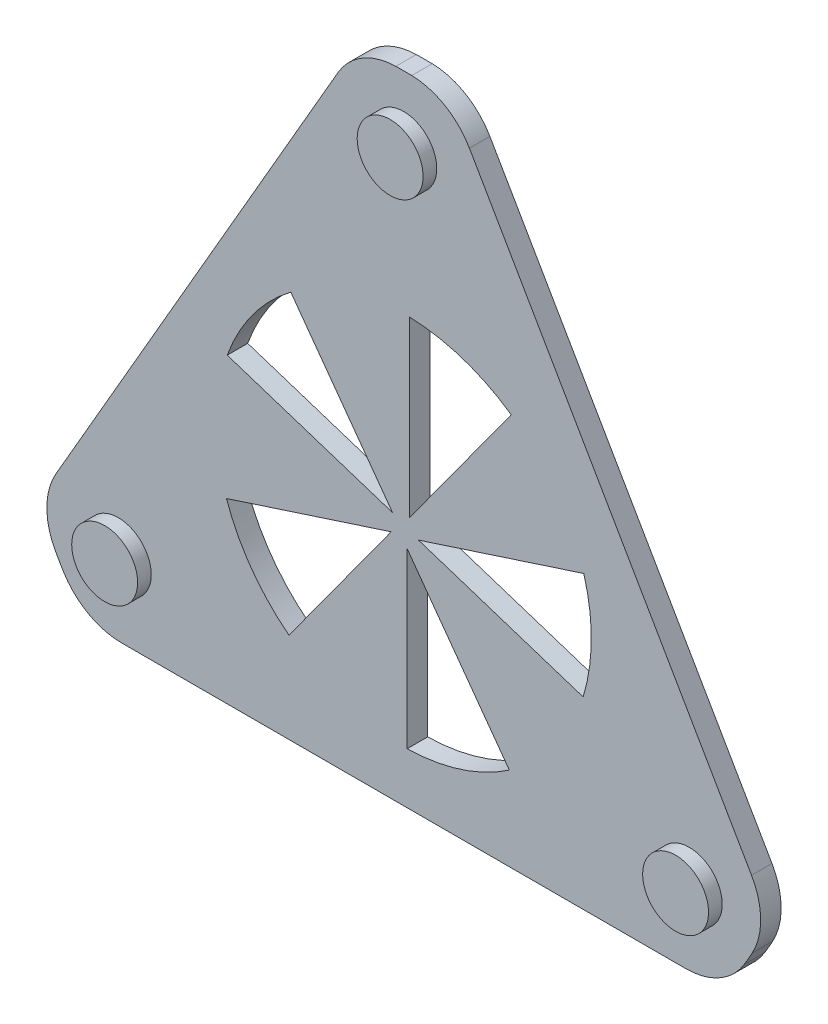
ISO-10303-21;
HEADER;
FILE_DESCRIPTION(('STEP AP214'),'2;1');
FILE_NAME('part.step','',(''),(''),'','','');
FILE_SCHEMA(('AUTOMOTIVE_DESIGN { 1 0 10303 214 1 1 1 1 }'));
ENDSEC;
DATA;
#1=APPLICATION_CONTEXT('core data for automotive mechanical design processes');
#2=APPLICATION_PROTOCOL_DEFINITION('international standard','automotive_design',2000,#1);
#3=PRODUCT_CONTEXT('',#1,'mechanical');
#4=PRODUCT('Part','Part','',(#3));
#5=PRODUCT_RELATED_PRODUCT_CATEGORY('part','',(#4));
#6=PRODUCT_DEFINITION_FORMATION('','',#4);
#7=PRODUCT_DEFINITION_CONTEXT('part definition',#1,'design');
#8=PRODUCT_DEFINITION('design','',#6,#7);
#9=PRODUCT_DEFINITION_SHAPE('','',#8);
#10=(LENGTH_UNIT() NAMED_UNIT(*) SI_UNIT(.MILLI.,.METRE.));
#11=(NAMED_UNIT(*) PLANE_ANGLE_UNIT() SI_UNIT($,.RADIAN.));
#12=(NAMED_UNIT(*) SI_UNIT($,.STERADIAN.) SOLID_ANGLE_UNIT());
#13=UNCERTAINTY_MEASURE_WITH_UNIT(LENGTH_MEASURE(1.E-05),#10,'distance_accuracy_value','');
#14=(GEOMETRIC_REPRESENTATION_CONTEXT(3) GLOBAL_UNCERTAINTY_ASSIGNED_CONTEXT((#13)) GLOBAL_UNIT_ASSIGNED_CONTEXT((#10,
#11,#12)) REPRESENTATION_CONTEXT('',''));
#15=CARTESIAN_POINT('',(0.,0.,0.));
#16=DIRECTION('',(0.,0.,1.));
#17=DIRECTION('',(1.,0.,0.));
#18=AXIS2_PLACEMENT_3D('',#15,#16,#17);
#19=CARTESIAN_POINT('',(0.,0.,8.2));
#20=DIRECTION('',(0.,0.,1.));
#21=DIRECTION('',(1.,0.,0.));
#22=AXIS2_PLACEMENT_3D('',#19,#20,#21);
#23=PLANE('',#22);
#24=DIRECTION('',(-0.587785252292473,-0.809016994374947,0.));
#25=VECTOR('',#24,1.);
#26=CARTESIAN_POINT('',(-0.242705098312481,0.17633557568774,8.2));
#27=LINE('',#26,#25);
#28=CARTESIAN_POINT('',(9.45414838131983,13.5229093905116,8.2));
#29=VERTEX_POINT('',#28);
#30=CARTESIAN_POINT('',(0.5,1.1985814452468,8.2));
#31=VERTEX_POINT('',#30);
#32=EDGE_CURVE('E274',#29,#31,#27,.T.);
#33=ORIENTED_EDGE('',*,*,#32,.F.);
#34=CARTESIAN_POINT('',(0.,0.,8.2));
#35=DIRECTION('',(0.,0.,1.));
#36=DIRECTION('',(1.,0.,0.));
#37=AXIS2_PLACEMENT_3D('',#34,#35,#36);
#38=CIRCLE('',#37,16.5);
#39=CARTESIAN_POINT('',(0.5,16.4924225024706,8.2));
#40=VERTEX_POINT('',#39);
#41=EDGE_CURVE('E228',#29,#40,#38,.T.);
#42=ORIENTED_EDGE('',*,*,#41,.T.);
#43=DIRECTION('',(0.,1.,0.));
#44=VECTOR('',#43,1.);
#45=CARTESIAN_POINT('',(0.5,0.,8.2));
#46=LINE('',#45,#44);
#47=EDGE_CURVE('E277',#31,#40,#46,.T.);
#48=ORIENTED_EDGE('',*,*,#47,.F.);
#49=EDGE_LOOP('',(#33,#42,#48));
#50=FACE_BOUND('',#49,.T.);
#51=CARTESIAN_POINT('',(0.,0.,8.2));
#52=DIRECTION('',(0.,0.,1.));
#53=DIRECTION('',(1.,0.,0.));
#54=AXIS2_PLACEMENT_3D('',#51,#52,#53);
#55=CIRCLE('',#54,16.5);
#56=CARTESIAN_POINT('',(15.7825436122852,-4.81262060901484,8.2));
#57=VERTEX_POINT('',#56);
#58=CARTESIAN_POINT('',(15.839734387655,4.62091057352765,8.2));
#59=VERTEX_POINT('',#58);
#60=EDGE_CURVE('E266',#57,#59,#55,.T.);
#61=ORIENTED_EDGE('',*,*,#60,.T.);
#62=DIRECTION('',(0.951056516295154,0.309016994374948,0.));
#63=VECTOR('',#62,1.);
#64=CARTESIAN_POINT('',(0.154508497187474,-0.475528258147577,8.2));
#65=LINE('',#64,#63);
#66=CARTESIAN_POINT('',(1.29442719099991,-0.105146222423827,8.2));
#67=VERTEX_POINT('',#66);
#68=EDGE_CURVE('E271',#67,#59,#65,.T.);
#69=ORIENTED_EDGE('',*,*,#68,.F.);
#70=DIRECTION('',(-0.951056516295154,0.309016994374948,0.));
#71=VECTOR('',#70,1.);
#72=CARTESIAN_POINT('',(0.0927050983124839,0.285316954888545,8.2));
#73=LINE('',#72,#71);
#74=EDGE_CURVE('E268',#57,#67,#73,.T.);
#75=ORIENTED_EDGE('',*,*,#74,.F.);
#76=EDGE_LOOP('',(#61,#69,#75));
#77=FACE_BOUND('',#76,.T.);
#78=DIRECTION('',(0.587785252292473,-0.809016994374947,0.));
#79=VECTOR('',#78,1.);
#80=CARTESIAN_POINT('',(-0.242705098312483,-0.176335575687741,8.2));
#81=LINE('',#80,#79);
#82=CARTESIAN_POINT('',(-9.93955857794479,13.1702382391362,8.2));
#83=VERTEX_POINT('',#82);
#84=CARTESIAN_POINT('',(-0.985410196624968,0.845910293871327,8.2));
#85=VERTEX_POINT('',#84);
#86=EDGE_CURVE('E258',#83,#85,#81,.T.);
#87=ORIENTED_EDGE('',*,*,#86,.F.);
#88=CARTESIAN_POINT('',(0.,0.,8.2));
#89=DIRECTION('',(0.,0.,1.));
#90=DIRECTION('',(1.,0.,0.));
#91=AXIS2_PLACEMENT_3D('',#88,#89,#90);
#92=CIRCLE('',#91,16.5);
#93=CARTESIAN_POINT('',(-15.5307173932801,5.5719670898228,8.2));
#94=VERTEX_POINT('',#93);
#95=EDGE_CURVE('E264',#83,#94,#92,.T.);
#96=ORIENTED_EDGE('',*,*,#95,.T.);
#97=DIRECTION('',(-0.951056516295154,0.309016994374947,0.));
#98=VECTOR('',#97,1.);
#99=CARTESIAN_POINT('',(0.154508497187474,0.475528258147577,8.2));
#100=LINE('',#99,#98);
#101=EDGE_CURVE('E261',#85,#94,#100,.T.);
#102=ORIENTED_EDGE('',*,*,#101,.F.);
#103=EDGE_LOOP('',(#87,#96,#102));
#104=FACE_BOUND('',#103,.T.);
#105=DIRECTION('',(0.951056516295154,0.309016994374948,0.));
#106=VECTOR('',#105,1.);
#107=CARTESIAN_POINT('',(0.0927050983124834,-0.285316954888544,8.2));
#108=LINE('',#107,#106);
#109=CARTESIAN_POINT('',(-15.5971334156603,-5.38325451879193,8.2));
#110=VERTEX_POINT('',#109);
#111=CARTESIAN_POINT('',(-1.10901699437494,-0.675780132200915,8.2));
#112=VERTEX_POINT('',#111);
#113=EDGE_CURVE('E250',#110,#112,#108,.T.);
#114=ORIENTED_EDGE('',*,*,#113,.F.);
#115=CARTESIAN_POINT('',(0.,0.,8.2));
#116=DIRECTION('',(0.,0.,1.));
#117=DIRECTION('',(1.,0.,0.));
#118=AXIS2_PLACEMENT_3D('',#115,#116,#117);
#119=CIRCLE('',#118,16.5);
#120=CARTESIAN_POINT('',(-10.0985112187162,-13.0487574567643,8.2));
#121=VERTEX_POINT('',#120);
#122=EDGE_CURVE('E256',#110,#121,#119,.T.);
#123=ORIENTED_EDGE('',*,*,#122,.T.);
#124=DIRECTION('',(-0.587785252292473,-0.809016994374947,0.));
#125=VECTOR('',#124,1.);
#126=CARTESIAN_POINT('',(-0.404508497187474,0.293892626146237,8.2));
#127=LINE('',#126,#125);
#128=EDGE_CURVE('E253',#112,#121,#127,.T.);
#129=ORIENTED_EDGE('',*,*,#128,.F.);
#130=EDGE_LOOP('',(#114,#123,#129));
#131=FACE_BOUND('',#130,.T.);
#132=DIRECTION('',(0.,1.,0.));
#133=VECTOR('',#132,1.);
#134=CARTESIAN_POINT('',(0.299999999999998,0.,8.2));
#135=LINE('',#134,#133);
#136=CARTESIAN_POINT('',(0.3,-16.497272501841,8.2));
#137=VERTEX_POINT('',#136);
#138=CARTESIAN_POINT('',(0.299999999999998,-1.26356538449339,8.2));
#139=VERTEX_POINT('',#138);
#140=EDGE_CURVE('E233',#137,#139,#135,.T.);
#141=ORIENTED_EDGE('',*,*,#140,.F.);
#142=CARTESIAN_POINT('',(0.,0.,8.2));
#143=DIRECTION('',(0.,0.,1.));
#144=DIRECTION('',(1.,0.,0.));
#145=AXIS2_PLACEMENT_3D('',#142,#143,#144);
#146=CIRCLE('',#145,16.5);
#147=CARTESIAN_POINT('',(9.2894942243413,-13.6365427090568,8.2));
#148=VERTEX_POINT('',#147);
#149=EDGE_CURVE('E235',#137,#148,#146,.T.);
#150=ORIENTED_EDGE('',*,*,#149,.T.);
#151=DIRECTION('',(0.587785252292473,-0.809016994374947,0.));
#152=VECTOR('',#151,1.);
#153=CARTESIAN_POINT('',(-0.404508497187474,-0.293892626146237,8.2));
#154=LINE('',#153,#152);
#155=EDGE_CURVE('E220',#139,#148,#154,.T.);
#156=ORIENTED_EDGE('',*,*,#155,.F.);
#157=EDGE_LOOP('',(#141,#150,#156));
#158=FACE_BOUND('',#157,.T.);
#159=CARTESIAN_POINT('',(0.,0.,8.2));
#160=DIRECTION('',(0.,0.,-1.));
#161=DIRECTION('',(-1.,0.,0.));
#162=AXIS2_PLACEMENT_3D('',#159,#160,#161);
#163=CIRCLE('',#162,35.);
#164=CARTESIAN_POINT('',(-29.9543846627366,-18.1034482758621,8.2));
#165=VERTEX_POINT('',#164);
#166=CARTESIAN_POINT('',(-30.6552384343624,-16.8895339347298,8.2));
#167=VERTEX_POINT('',#166);
#168=EDGE_CURVE('E417',#165,#167,#163,.T.);
#169=ORIENTED_EDGE('',*,*,#168,.T.);
#170=CARTESIAN_POINT('',(-25.4000547027574,-13.9941852602047,8.2));
#171=DIRECTION('',(0.,0.,1.));
#172=DIRECTION('',(1.,0.,0.));
#173=AXIS2_PLACEMENT_3D('',#170,#171,#172);
#174=CIRCLE('',#173,6.);
#175=CARTESIAN_POINT('',(-30.5962071254641,-10.9941852602047,8.2));
#176=VERTEX_POINT('',#175);
#177=EDGE_CURVE('E371',#167,#176,#174,.F.);
#178=ORIENTED_EDGE('',*,*,#177,.T.);
#179=DIRECTION('',(0.5,0.866025403784439,0.));
#180=VECTOR('',#179,1.);
#181=CARTESIAN_POINT('',(-36.3730669589464,-21.,8.2));
#182=LINE('',#181,#180);
#183=CARTESIAN_POINT('',(-5.77685983348236,31.9941852602047,8.2));
#184=VERTEX_POINT('',#183);
#185=EDGE_CURVE('E456',#176,#184,#182,.T.);
#186=ORIENTED_EDGE('',*,*,#185,.T.);
#187=CARTESIAN_POINT('',(-0.580707410775721,28.9941852602047,8.2));
#188=DIRECTION('',(0.,0.,1.));
#189=DIRECTION('',(1.,0.,0.));
#190=AXIS2_PLACEMENT_3D('',#187,#188,#189);
#191=CIRCLE('',#190,6.);
#192=CARTESIAN_POINT('',(-0.700853771625869,34.9929822105919,8.2));
#193=VERTEX_POINT('',#192);
#194=EDGE_CURVE('E363',#184,#193,#191,.F.);
#195=ORIENTED_EDGE('',*,*,#194,.T.);
#196=CARTESIAN_POINT('',(0.700853771625863,34.9929822105919,8.2));
#197=VERTEX_POINT('',#196);
#198=EDGE_CURVE('E407',#193,#197,#163,.T.);
#199=ORIENTED_EDGE('',*,*,#198,.T.);
#200=CARTESIAN_POINT('',(0.580707410775715,28.9941852602047,8.2));
#201=DIRECTION('',(0.,0.,1.));
#202=DIRECTION('',(1.,0.,0.));
#203=AXIS2_PLACEMENT_3D('',#200,#201,#202);
#204=CIRCLE('',#203,6.);
#205=CARTESIAN_POINT('',(5.77685983348235,31.9941852602047,8.2));
#206=VERTEX_POINT('',#205);
#207=EDGE_CURVE('E361',#197,#206,#204,.F.);
#208=ORIENTED_EDGE('',*,*,#207,.T.);
#209=DIRECTION('',(0.5,-0.866025403784439,0.));
#210=VECTOR('',#209,1.);
#211=CARTESIAN_POINT('',(0.,42.,8.2));
#212=LINE('',#211,#210);
#213=CARTESIAN_POINT('',(30.5962071254641,-10.9941852602047,8.2));
#214=VERTEX_POINT('',#213);
#215=EDGE_CURVE('E452',#206,#214,#212,.T.);
#216=ORIENTED_EDGE('',*,*,#215,.T.);
#217=CARTESIAN_POINT('',(25.4000547027574,-13.9941852602047,8.2));
#218=DIRECTION('',(0.,0.,1.));
#219=DIRECTION('',(1.,0.,0.));
#220=AXIS2_PLACEMENT_3D('',#217,#218,#219);
#221=CIRCLE('',#220,6.);
#222=CARTESIAN_POINT('',(30.6552384343624,-16.8895339347298,8.2));
#223=VERTEX_POINT('',#222);
#224=EDGE_CURVE('E365',#214,#223,#221,.F.);
#225=ORIENTED_EDGE('',*,*,#224,.T.);
#226=CARTESIAN_POINT('',(29.9543846627366,-18.1034482758621,8.2));
#227=VERTEX_POINT('',#226);
#228=EDGE_CURVE('E246',#223,#227,#163,.T.);
#229=ORIENTED_EDGE('',*,*,#228,.T.);
#230=CARTESIAN_POINT('',(24.8193472919817,-15.,8.2));
#231=DIRECTION('',(0.,0.,1.));
#232=DIRECTION('',(1.,0.,0.));
#233=AXIS2_PLACEMENT_3D('',#230,#231,#232);
#234=CIRCLE('',#233,6.);
#235=CARTESIAN_POINT('',(24.8193472919817,-21.,8.2));
#236=VERTEX_POINT('',#235);
#237=EDGE_CURVE('E367',#227,#236,#234,.F.);
#238=ORIENTED_EDGE('',*,*,#237,.T.);
#239=DIRECTION('',(-1.,0.,0.));
#240=VECTOR('',#239,1.);
#241=CARTESIAN_POINT('',(36.3730669589464,-21.,8.2));
#242=LINE('',#241,#240);
#243=CARTESIAN_POINT('',(-24.8193472919817,-21.,8.2));
#244=VERTEX_POINT('',#243);
#245=EDGE_CURVE('E444',#236,#244,#242,.T.);
#246=ORIENTED_EDGE('',*,*,#245,.T.);
#247=CARTESIAN_POINT('',(-24.8193472919817,-15.,8.2));
#248=DIRECTION('',(0.,0.,1.));
#249=DIRECTION('',(1.,0.,0.));
#250=AXIS2_PLACEMENT_3D('',#247,#248,#249);
#251=CIRCLE('',#250,6.);
#252=EDGE_CURVE('E369',#244,#165,#251,.F.);
#253=ORIENTED_EDGE('',*,*,#252,.T.);
#254=EDGE_LOOP('',(#169,#178,#186,#195,#199,#208,#216,#225,#229,#238,#246,#253));
#255=FACE_BOUND('',#254,.T.);
#256=ADVANCED_FACE('F37',(#50,#77,#104,#131,#158,#255),#23,.F.);
#257=CARTESIAN_POINT('',(0.,0.,10.));
#258=DIRECTION('',(0.,0.,1.));
#259=DIRECTION('',(1.,0.,0.));
#260=AXIS2_PLACEMENT_3D('',#257,#258,#259);
#261=PLANE('',#260);
#262=DIRECTION('',(0.,1.,0.));
#263=VECTOR('',#262,1.);
#264=CARTESIAN_POINT('',(0.299999999999998,0.,10.));
#265=LINE('',#264,#263);
#266=CARTESIAN_POINT('',(0.3,-16.497272501841,10.));
#267=VERTEX_POINT('',#266);
#268=CARTESIAN_POINT('',(0.299999999999998,-1.26356538449339,10.));
#269=VERTEX_POINT('',#268);
#270=EDGE_CURVE('E281',#267,#269,#265,.T.);
#271=ORIENTED_EDGE('',*,*,#270,.T.);
#272=DIRECTION('',(0.587785252292473,-0.809016994374947,0.));
#273=VECTOR('',#272,1.);
#274=CARTESIAN_POINT('',(-0.404508497187474,-0.293892626146237,10.));
#275=LINE('',#274,#273);
#276=CARTESIAN_POINT('',(9.2894942243413,-13.6365427090568,10.));
#277=VERTEX_POINT('',#276);
#278=EDGE_CURVE('E222',#269,#277,#275,.T.);
#279=ORIENTED_EDGE('',*,*,#278,.T.);
#280=CARTESIAN_POINT('',(0.,0.,10.));
#281=DIRECTION('',(0.,0.,1.));
#282=DIRECTION('',(1.,0.,0.));
#283=AXIS2_PLACEMENT_3D('',#280,#281,#282);
#284=CIRCLE('',#283,16.5);
#285=EDGE_CURVE('E285',#267,#277,#284,.T.);
#286=ORIENTED_EDGE('',*,*,#285,.F.);
#287=EDGE_LOOP('',(#271,#279,#286));
#288=FACE_BOUND('',#287,.T.);
#289=DIRECTION('',(0.951056516295154,0.309016994374948,0.));
#290=VECTOR('',#289,1.);
#291=CARTESIAN_POINT('',(0.0927050983124834,-0.285316954888544,10.));
#292=LINE('',#291,#290);
#293=CARTESIAN_POINT('',(-15.5971334156603,-5.38325451879193,10.));
#294=VERTEX_POINT('',#293);
#295=CARTESIAN_POINT('',(-1.10901699437494,-0.675780132200915,10.));
#296=VERTEX_POINT('',#295);
#297=EDGE_CURVE('E288',#294,#296,#292,.T.);
#298=ORIENTED_EDGE('',*,*,#297,.T.);
#299=DIRECTION('',(-0.587785252292473,-0.809016994374947,0.));
#300=VECTOR('',#299,1.);
#301=CARTESIAN_POINT('',(-0.404508497187474,0.293892626146237,10.));
#302=LINE('',#301,#300);
#303=CARTESIAN_POINT('',(-10.0985112187162,-13.0487574567643,10.));
#304=VERTEX_POINT('',#303);
#305=EDGE_CURVE('E291',#296,#304,#302,.T.);
#306=ORIENTED_EDGE('',*,*,#305,.T.);
#307=CARTESIAN_POINT('',(0.,0.,10.));
#308=DIRECTION('',(0.,0.,1.));
#309=DIRECTION('',(1.,0.,0.));
#310=AXIS2_PLACEMENT_3D('',#307,#308,#309);
#311=CIRCLE('',#310,16.5);
#312=EDGE_CURVE('E294',#294,#304,#311,.T.);
#313=ORIENTED_EDGE('',*,*,#312,.F.);
#314=EDGE_LOOP('',(#298,#306,#313));
#315=FACE_BOUND('',#314,.T.);
#316=DIRECTION('',(0.587785252292473,-0.809016994374947,0.));
#317=VECTOR('',#316,1.);
#318=CARTESIAN_POINT('',(-0.242705098312483,-0.176335575687741,10.));
#319=LINE('',#318,#317);
#320=CARTESIAN_POINT('',(-9.93955857794479,13.1702382391362,10.));
#321=VERTEX_POINT('',#320);
#322=CARTESIAN_POINT('',(-0.985410196624968,0.845910293871327,10.));
#323=VERTEX_POINT('',#322);
#324=EDGE_CURVE('E297',#321,#323,#319,.T.);
#325=ORIENTED_EDGE('',*,*,#324,.T.);
#326=DIRECTION('',(-0.951056516295154,0.309016994374947,0.));
#327=VECTOR('',#326,1.);
#328=CARTESIAN_POINT('',(0.154508497187474,0.475528258147577,10.));
#329=LINE('',#328,#327);
#330=CARTESIAN_POINT('',(-15.5307173932801,5.5719670898228,10.));
#331=VERTEX_POINT('',#330);
#332=EDGE_CURVE('E300',#323,#331,#329,.T.);
#333=ORIENTED_EDGE('',*,*,#332,.T.);
#334=CARTESIAN_POINT('',(0.,0.,10.));
#335=DIRECTION('',(0.,0.,1.));
#336=DIRECTION('',(1.,0.,0.));
#337=AXIS2_PLACEMENT_3D('',#334,#335,#336);
#338=CIRCLE('',#337,16.5);
#339=EDGE_CURVE('E303',#321,#331,#338,.T.);
#340=ORIENTED_EDGE('',*,*,#339,.F.);
#341=EDGE_LOOP('',(#325,#333,#340));
#342=FACE_BOUND('',#341,.T.);
#343=CARTESIAN_POINT('',(0.,0.,10.));
#344=DIRECTION('',(0.,0.,1.));
#345=DIRECTION('',(1.,0.,0.));
#346=AXIS2_PLACEMENT_3D('',#343,#344,#345);
#347=CIRCLE('',#346,16.5);
#348=CARTESIAN_POINT('',(15.7825436122852,-4.81262060901484,10.));
#349=VERTEX_POINT('',#348);
#350=CARTESIAN_POINT('',(15.839734387655,4.62091057352765,10.));
#351=VERTEX_POINT('',#350);
#352=EDGE_CURVE('E306',#349,#351,#347,.T.);
#353=ORIENTED_EDGE('',*,*,#352,.F.);
#354=DIRECTION('',(-0.951056516295154,0.309016994374948,0.));
#355=VECTOR('',#354,1.);
#356=CARTESIAN_POINT('',(0.0927050983124839,0.285316954888545,10.));
#357=LINE('',#356,#355);
#358=CARTESIAN_POINT('',(1.29442719099991,-0.105146222423827,10.));
#359=VERTEX_POINT('',#358);
#360=EDGE_CURVE('E309',#349,#359,#357,.T.);
#361=ORIENTED_EDGE('',*,*,#360,.T.);
#362=DIRECTION('',(0.951056516295154,0.309016994374948,0.));
#363=VECTOR('',#362,1.);
#364=CARTESIAN_POINT('',(0.154508497187474,-0.475528258147577,10.));
#365=LINE('',#364,#363);
#366=EDGE_CURVE('E312',#359,#351,#365,.T.);
#367=ORIENTED_EDGE('',*,*,#366,.T.);
#368=EDGE_LOOP('',(#353,#361,#367));
#369=FACE_BOUND('',#368,.T.);
#370=DIRECTION('',(-0.587785252292473,-0.809016994374947,0.));
#371=VECTOR('',#370,1.);
#372=CARTESIAN_POINT('',(-0.242705098312481,0.17633557568774,10.));
#373=LINE('',#372,#371);
#374=CARTESIAN_POINT('',(9.45414838131983,13.5229093905116,10.));
#375=VERTEX_POINT('',#374);
#376=CARTESIAN_POINT('',(0.5,1.1985814452468,10.));
#377=VERTEX_POINT('',#376);
#378=EDGE_CURVE('E315',#375,#377,#373,.T.);
#379=ORIENTED_EDGE('',*,*,#378,.T.);
#380=DIRECTION('',(0.,1.,0.));
#381=VECTOR('',#380,1.);
#382=CARTESIAN_POINT('',(0.5,0.,10.));
#383=LINE('',#382,#381);
#384=CARTESIAN_POINT('',(0.5,16.4924225024706,10.));
#385=VERTEX_POINT('',#384);
#386=EDGE_CURVE('E243',#377,#385,#383,.T.);
#387=ORIENTED_EDGE('',*,*,#386,.T.);
#388=CARTESIAN_POINT('',(0.,0.,10.));
#389=DIRECTION('',(0.,0.,1.));
#390=DIRECTION('',(1.,0.,0.));
#391=AXIS2_PLACEMENT_3D('',#388,#389,#390);
#392=CIRCLE('',#391,16.5);
#393=EDGE_CURVE('E240',#375,#385,#392,.T.);
#394=ORIENTED_EDGE('',*,*,#393,.F.);
#395=EDGE_LOOP('',(#379,#387,#394));
#396=FACE_BOUND('',#395,.T.);
#397=CARTESIAN_POINT('',(0.,29.,10.));
#398=DIRECTION('',(0.,0.,1.));
#399=DIRECTION('',(1.,0.,0.));
#400=AXIS2_PLACEMENT_3D('',#397,#398,#399);
#401=CIRCLE('',#400,2.9);
#402=CARTESIAN_POINT('',(2.9,29.,10.));
#403=VERTEX_POINT('',#402);
#404=EDGE_CURVE('E322',#403,#403,#401,.T.);
#405=ORIENTED_EDGE('',*,*,#404,.F.);
#406=EDGE_LOOP('',(#405));
#407=FACE_BOUND('',#406,.T.);
#408=CARTESIAN_POINT('',(-25.1147367097503,-14.4999999999991,10.));
#409=DIRECTION('',(0.,0.,1.));
#410=DIRECTION('',(1.,0.,0.));
#411=AXIS2_PLACEMENT_3D('',#408,#409,#410);
#412=CIRCLE('',#411,2.9);
#413=CARTESIAN_POINT('',(-22.2147367097503,-14.4999999999991,10.));
#414=VERTEX_POINT('',#413);
#415=EDGE_CURVE('E349',#414,#414,#412,.T.);
#416=ORIENTED_EDGE('',*,*,#415,.F.);
#417=EDGE_LOOP('',(#416));
#418=FACE_BOUND('',#417,.T.);
#419=CARTESIAN_POINT('',(25.1147367097471,-14.5000000000009,10.));
#420=DIRECTION('',(0.,0.,1.));
#421=DIRECTION('',(1.,0.,0.));
#422=AXIS2_PLACEMENT_3D('',#419,#420,#421);
#423=CIRCLE('',#422,2.9);
#424=CARTESIAN_POINT('',(28.0147367097471,-14.5000000000009,10.));
#425=VERTEX_POINT('',#424);
#426=EDGE_CURVE('E352',#425,#425,#423,.T.);
#427=ORIENTED_EDGE('',*,*,#426,.F.);
#428=EDGE_LOOP('',(#427));
#429=FACE_BOUND('',#428,.T.);
#430=DIRECTION('',(-0.5,-0.866025403784439,0.));
#431=VECTOR('',#430,1.);
#432=CARTESIAN_POINT('',(-18.1865334794732,10.5,10.));
#433=LINE('',#432,#431);
#434=CARTESIAN_POINT('',(-5.77685983348236,31.9941852602047,10.));
#435=VERTEX_POINT('',#434);
#436=CARTESIAN_POINT('',(-30.5962071254641,-10.9941852602047,10.));
#437=VERTEX_POINT('',#436);
#438=EDGE_CURVE('E461',#435,#437,#433,.T.);
#439=ORIENTED_EDGE('',*,*,#438,.T.);
#440=CARTESIAN_POINT('',(-25.4000547027574,-13.9941852602047,10.));
#441=DIRECTION('',(0.,0.,1.));
#442=DIRECTION('',(1.,0.,0.));
#443=AXIS2_PLACEMENT_3D('',#440,#441,#442);
#444=CIRCLE('',#443,6.);
#445=CARTESIAN_POINT('',(-30.6552384343624,-16.8895339347298,10.));
#446=VERTEX_POINT('',#445);
#447=EDGE_CURVE('E386',#437,#446,#444,.T.);
#448=ORIENTED_EDGE('',*,*,#447,.T.);
#449=CARTESIAN_POINT('',(0.,0.,10.));
#450=DIRECTION('',(0.,0.,-1.));
#451=DIRECTION('',(-1.,0.,0.));
#452=AXIS2_PLACEMENT_3D('',#449,#450,#451);
#453=CIRCLE('',#452,35.);
#454=CARTESIAN_POINT('',(-29.9543846627366,-18.1034482758621,10.));
#455=VERTEX_POINT('',#454);
#456=EDGE_CURVE('E416',#455,#446,#453,.T.);
#457=ORIENTED_EDGE('',*,*,#456,.F.);
#458=CARTESIAN_POINT('',(-24.8193472919817,-15.,10.));
#459=DIRECTION('',(0.,0.,1.));
#460=DIRECTION('',(1.,0.,0.));
#461=AXIS2_PLACEMENT_3D('',#458,#459,#460);
#462=CIRCLE('',#461,6.);
#463=CARTESIAN_POINT('',(-24.8193472919817,-21.,10.));
#464=VERTEX_POINT('',#463);
#465=EDGE_CURVE('E384',#455,#464,#462,.T.);
#466=ORIENTED_EDGE('',*,*,#465,.T.);
#467=DIRECTION('',(1.,0.,0.));
#468=VECTOR('',#467,1.);
#469=CARTESIAN_POINT('',(0.,-21.,10.));
#470=LINE('',#469,#468);
#471=CARTESIAN_POINT('',(24.8193472919817,-21.,10.));
#472=VERTEX_POINT('',#471);
#473=EDGE_CURVE('E454',#464,#472,#470,.T.);
#474=ORIENTED_EDGE('',*,*,#473,.T.);
#475=CARTESIAN_POINT('',(24.8193472919817,-15.,10.));
#476=DIRECTION('',(0.,0.,1.));
#477=DIRECTION('',(1.,0.,0.));
#478=AXIS2_PLACEMENT_3D('',#475,#476,#477);
#479=CIRCLE('',#478,6.);
#480=CARTESIAN_POINT('',(29.9543846627366,-18.1034482758621,10.));
#481=VERTEX_POINT('',#480);
#482=EDGE_CURVE('E382',#472,#481,#479,.T.);
#483=ORIENTED_EDGE('',*,*,#482,.T.);
#484=CARTESIAN_POINT('',(30.6552384343624,-16.8895339347298,10.));
#485=VERTEX_POINT('',#484);
#486=EDGE_CURVE('E419',#485,#481,#453,.T.);
#487=ORIENTED_EDGE('',*,*,#486,.F.);
#488=CARTESIAN_POINT('',(25.4000547027574,-13.9941852602047,10.));
#489=DIRECTION('',(0.,0.,1.));
#490=DIRECTION('',(1.,0.,0.));
#491=AXIS2_PLACEMENT_3D('',#488,#489,#490);
#492=CIRCLE('',#491,6.);
#493=CARTESIAN_POINT('',(30.5962071254641,-10.9941852602047,10.));
#494=VERTEX_POINT('',#493);
#495=EDGE_CURVE('E59',#485,#494,#492,.T.);
#496=ORIENTED_EDGE('',*,*,#495,.T.);
#497=DIRECTION('',(-0.5,0.866025403784439,0.));
#498=VECTOR('',#497,1.);
#499=CARTESIAN_POINT('',(18.1865334794732,10.5,10.));
#500=LINE('',#499,#498);
#501=CARTESIAN_POINT('',(5.77685983348235,31.9941852602047,10.));
#502=VERTEX_POINT('',#501);
#503=EDGE_CURVE('E451',#494,#502,#500,.T.);
#504=ORIENTED_EDGE('',*,*,#503,.T.);
#505=CARTESIAN_POINT('',(0.580707410775715,28.9941852602047,10.));
#506=DIRECTION('',(0.,0.,1.));
#507=DIRECTION('',(1.,0.,0.));
#508=AXIS2_PLACEMENT_3D('',#505,#506,#507);
#509=CIRCLE('',#508,6.);
#510=CARTESIAN_POINT('',(0.700853771625863,34.9929822105919,10.));
#511=VERTEX_POINT('',#510);
#512=EDGE_CURVE('E377',#502,#511,#509,.T.);
#513=ORIENTED_EDGE('',*,*,#512,.T.);
#514=CARTESIAN_POINT('',(-0.700853771625869,34.9929822105919,10.));
#515=VERTEX_POINT('',#514);
#516=EDGE_CURVE('E283',#515,#511,#453,.T.);
#517=ORIENTED_EDGE('',*,*,#516,.F.);
#518=CARTESIAN_POINT('',(-0.580707410775721,28.9941852602047,10.));
#519=DIRECTION('',(0.,0.,1.));
#520=DIRECTION('',(1.,0.,0.));
#521=AXIS2_PLACEMENT_3D('',#518,#519,#520);
#522=CIRCLE('',#521,6.);
#523=EDGE_CURVE('E379',#515,#435,#522,.T.);
#524=ORIENTED_EDGE('',*,*,#523,.T.);
#525=EDGE_LOOP('',(#439,#448,#457,#466,#474,#483,#487,#496,#504,#513,#517,#524));
#526=FACE_BOUND('',#525,.T.);
#527=ADVANCED_FACE('F482',(#288,#315,#342,#369,#396,#407,#418,#429,#526),#261,.T.);
#528=CARTESIAN_POINT('',(0.,0.,10.));
#529=DIRECTION('',(0.,0.,-1.));
#530=DIRECTION('',(-1.,0.,0.));
#531=AXIS2_PLACEMENT_3D('',#528,#529,#530);
#532=CYLINDRICAL_SURFACE('',#531,35.);
#533=ORIENTED_EDGE('',*,*,#198,.F.);
#534=DIRECTION('',(0.,0.,-1.));
#535=VECTOR('',#534,1.);
#536=CARTESIAN_POINT('',(-0.70085377162587,34.9929822105919,10.));
#537=LINE('',#536,#535);
#538=EDGE_CURVE('E11',#193,#515,#537,.F.);
#539=ORIENTED_EDGE('',*,*,#538,.T.);
#540=ORIENTED_EDGE('',*,*,#516,.T.);
#541=DIRECTION('',(0.,0.,-1.));
#542=VECTOR('',#541,1.);
#543=CARTESIAN_POINT('',(0.700853771625863,34.9929822105919,10.));
#544=LINE('',#543,#542);
#545=EDGE_CURVE('E45',#511,#197,#544,.T.);
#546=ORIENTED_EDGE('',*,*,#545,.T.);
#547=EDGE_LOOP('',(#533,#539,#540,#546));
#548=FACE_BOUND('',#547,.T.);
#549=ADVANCED_FACE('F406',(#548),#532,.T.);
#550=ORIENTED_EDGE('',*,*,#456,.T.);
#551=DIRECTION('',(0.,0.,-1.));
#552=VECTOR('',#551,1.);
#553=CARTESIAN_POINT('',(-30.6552384343624,-16.8895339347298,10.));
#554=LINE('',#553,#552);
#555=EDGE_CURVE('E358',#446,#167,#554,.T.);
#556=ORIENTED_EDGE('',*,*,#555,.T.);
#557=ORIENTED_EDGE('',*,*,#168,.F.);
#558=DIRECTION('',(0.,0.,-1.));
#559=VECTOR('',#558,1.);
#560=CARTESIAN_POINT('',(-29.9543846627366,-18.1034482758621,10.));
#561=LINE('',#560,#559);
#562=EDGE_CURVE('E355',#165,#455,#561,.F.);
#563=ORIENTED_EDGE('',*,*,#562,.T.);
#564=EDGE_LOOP('',(#550,#556,#557,#563));
#565=FACE_BOUND('',#564,.T.);
#566=ADVANCED_FACE('F583',(#565),#532,.T.);
#567=ORIENTED_EDGE('',*,*,#486,.T.);
#568=DIRECTION('',(0.,0.,-1.));
#569=VECTOR('',#568,1.);
#570=CARTESIAN_POINT('',(29.9543846627366,-18.1034482758621,10.));
#571=LINE('',#570,#569);
#572=EDGE_CURVE('E395',#481,#227,#571,.T.);
#573=ORIENTED_EDGE('',*,*,#572,.T.);
#574=ORIENTED_EDGE('',*,*,#228,.F.);
#575=DIRECTION('',(0.,0.,-1.));
#576=VECTOR('',#575,1.);
#577=CARTESIAN_POINT('',(30.6552384343624,-16.8895339347298,10.));
#578=LINE('',#577,#576);
#579=EDGE_CURVE('E392',#223,#485,#578,.F.);
#580=ORIENTED_EDGE('',*,*,#579,.T.);
#581=EDGE_LOOP('',(#567,#573,#574,#580));
#582=FACE_BOUND('',#581,.T.);
#583=ADVANCED_FACE('F435',(#582),#532,.T.);
#584=CARTESIAN_POINT('',(-0.242705098312481,0.17633557568774,8.2));
#585=DIRECTION('',(-0.809016994374947,0.587785252292473,0.));
#586=DIRECTION('',(-0.587785252292473,-0.809016994374948,0.));
#587=AXIS2_PLACEMENT_3D('',#584,#585,#586);
#588=PLANE('',#587);
#589=ORIENTED_EDGE('',*,*,#378,.F.);
#590=DIRECTION('',(0.,0.,1.));
#591=VECTOR('',#590,1.);
#592=CARTESIAN_POINT('',(9.45414838131983,13.5229093905116,8.2));
#593=LINE('',#592,#591);
#594=EDGE_CURVE('E320',#29,#375,#593,.T.);
#595=ORIENTED_EDGE('',*,*,#594,.F.);
#596=ORIENTED_EDGE('',*,*,#32,.T.);
#597=DIRECTION('',(0.,0.,1.));
#598=VECTOR('',#597,1.);
#599=CARTESIAN_POINT('',(0.5,1.1985814452468,8.2));
#600=LINE('',#599,#598);
#601=EDGE_CURVE('E325',#31,#377,#600,.T.);
#602=ORIENTED_EDGE('',*,*,#601,.T.);
#603=EDGE_LOOP('',(#589,#595,#596,#602));
#604=FACE_BOUND('',#603,.T.);
#605=ADVANCED_FACE('F499',(#604),#588,.T.);
#606=CARTESIAN_POINT('',(0.,0.,8.2));
#607=DIRECTION('',(0.,0.,1.));
#608=DIRECTION('',(1.,0.,0.));
#609=AXIS2_PLACEMENT_3D('',#606,#607,#608);
#610=CYLINDRICAL_SURFACE('',#609,16.5);
#611=ORIENTED_EDGE('',*,*,#393,.T.);
#612=DIRECTION('',(0.,0.,1.));
#613=VECTOR('',#612,1.);
#614=CARTESIAN_POINT('',(0.5,16.4924225024706,8.2));
#615=LINE('',#614,#613);
#616=EDGE_CURVE('E323',#40,#385,#615,.T.);
#617=ORIENTED_EDGE('',*,*,#616,.F.);
#618=ORIENTED_EDGE('',*,*,#41,.F.);
#619=ORIENTED_EDGE('',*,*,#594,.T.);
#620=EDGE_LOOP('',(#611,#617,#618,#619));
#621=FACE_BOUND('',#620,.T.);
#622=ADVANCED_FACE('F495',(#621),#610,.F.);
#623=CARTESIAN_POINT('',(0.,0.,8.2));
#624=DIRECTION('',(0.,0.,1.));
#625=DIRECTION('',(1.,0.,0.));
#626=AXIS2_PLACEMENT_3D('',#623,#624,#625);
#627=CYLINDRICAL_SURFACE('',#626,16.5);
#628=ORIENTED_EDGE('',*,*,#352,.T.);
#629=DIRECTION('',(0.,0.,1.));
#630=VECTOR('',#629,1.);
#631=CARTESIAN_POINT('',(15.839734387655,4.62091057352765,8.2));
#632=LINE('',#631,#630);
#633=EDGE_CURVE('E327',#59,#351,#632,.T.);
#634=ORIENTED_EDGE('',*,*,#633,.F.);
#635=ORIENTED_EDGE('',*,*,#60,.F.);
#636=DIRECTION('',(0.,0.,1.));
#637=VECTOR('',#636,1.);
#638=CARTESIAN_POINT('',(15.7825436122852,-4.81262060901484,8.2));
#639=LINE('',#638,#637);
#640=EDGE_CURVE('E331',#57,#349,#639,.T.);
#641=ORIENTED_EDGE('',*,*,#640,.T.);
#642=EDGE_LOOP('',(#628,#634,#635,#641));
#643=FACE_BOUND('',#642,.T.);
#644=ADVANCED_FACE('F498',(#643),#627,.F.);
#645=CARTESIAN_POINT('',(0.154508497187474,-0.475528258147577,8.2));
#646=DIRECTION('',(0.309016994374948,-0.951056516295154,0.));
#647=DIRECTION('',(0.951056516295154,0.309016994374948,0.));
#648=AXIS2_PLACEMENT_3D('',#645,#646,#647);
#649=PLANE('',#648);
#650=ORIENTED_EDGE('',*,*,#366,.F.);
#651=DIRECTION('',(0.,0.,1.));
#652=VECTOR('',#651,1.);
#653=CARTESIAN_POINT('',(1.29442719099991,-0.105146222423827,8.2));
#654=LINE('',#653,#652);
#655=EDGE_CURVE('E329',#67,#359,#654,.T.);
#656=ORIENTED_EDGE('',*,*,#655,.F.);
#657=ORIENTED_EDGE('',*,*,#68,.T.);
#658=ORIENTED_EDGE('',*,*,#633,.T.);
#659=EDGE_LOOP('',(#650,#656,#657,#658));
#660=FACE_BOUND('',#659,.T.);
#661=ADVANCED_FACE('F510',(#660),#649,.T.);
#662=CARTESIAN_POINT('',(-0.242705098312483,-0.176335575687741,8.2));
#663=DIRECTION('',(-0.809016994374947,-0.587785252292473,0.));
#664=DIRECTION('',(0.587785252292473,-0.809016994374948,0.));
#665=AXIS2_PLACEMENT_3D('',#662,#663,#664);
#666=PLANE('',#665);
#667=ORIENTED_EDGE('',*,*,#324,.F.);
#668=DIRECTION('',(0.,0.,1.));
#669=VECTOR('',#668,1.);
#670=CARTESIAN_POINT('',(-9.93955857794479,13.1702382391362,8.2));
#671=LINE('',#670,#669);
#672=EDGE_CURVE('E333',#83,#321,#671,.T.);
#673=ORIENTED_EDGE('',*,*,#672,.F.);
#674=ORIENTED_EDGE('',*,*,#86,.T.);
#675=DIRECTION('',(0.,0.,1.));
#676=VECTOR('',#675,1.);
#677=CARTESIAN_POINT('',(-0.985410196624968,0.845910293871327,8.2));
#678=LINE('',#677,#676);
#679=EDGE_CURVE('E337',#85,#323,#678,.T.);
#680=ORIENTED_EDGE('',*,*,#679,.T.);
#681=EDGE_LOOP('',(#667,#673,#674,#680));
#682=FACE_BOUND('',#681,.T.);
#683=ADVANCED_FACE('F513',(#682),#666,.T.);
#684=CARTESIAN_POINT('',(0.,0.,8.2));
#685=DIRECTION('',(0.,0.,1.));
#686=DIRECTION('',(1.,0.,0.));
#687=AXIS2_PLACEMENT_3D('',#684,#685,#686);
#688=CYLINDRICAL_SURFACE('',#687,16.5);
#689=ORIENTED_EDGE('',*,*,#339,.T.);
#690=DIRECTION('',(0.,0.,1.));
#691=VECTOR('',#690,1.);
#692=CARTESIAN_POINT('',(-15.5307173932801,5.5719670898228,8.2));
#693=LINE('',#692,#691);
#694=EDGE_CURVE('E335',#94,#331,#693,.T.);
#695=ORIENTED_EDGE('',*,*,#694,.F.);
#696=ORIENTED_EDGE('',*,*,#95,.F.);
#697=ORIENTED_EDGE('',*,*,#672,.T.);
#698=EDGE_LOOP('',(#689,#695,#696,#697));
#699=FACE_BOUND('',#698,.T.);
#700=ADVANCED_FACE('F522',(#699),#688,.F.);
#701=CARTESIAN_POINT('',(0.0927050983124834,-0.285316954888544,8.2));
#702=DIRECTION('',(0.309016994374947,-0.951056516295153,0.));
#703=DIRECTION('',(0.951056516295154,0.309016994374948,0.));
#704=AXIS2_PLACEMENT_3D('',#701,#702,#703);
#705=PLANE('',#704);
#706=ORIENTED_EDGE('',*,*,#297,.F.);
#707=DIRECTION('',(0.,0.,1.));
#708=VECTOR('',#707,1.);
#709=CARTESIAN_POINT('',(-15.5971334156603,-5.38325451879193,8.2));
#710=LINE('',#709,#708);
#711=EDGE_CURVE('E339',#110,#294,#710,.T.);
#712=ORIENTED_EDGE('',*,*,#711,.F.);
#713=ORIENTED_EDGE('',*,*,#113,.T.);
#714=DIRECTION('',(0.,0.,1.));
#715=VECTOR('',#714,1.);
#716=CARTESIAN_POINT('',(-1.10901699437494,-0.675780132200915,8.2));
#717=LINE('',#716,#715);
#718=EDGE_CURVE('E343',#112,#296,#717,.T.);
#719=ORIENTED_EDGE('',*,*,#718,.T.);
#720=EDGE_LOOP('',(#706,#712,#713,#719));
#721=FACE_BOUND('',#720,.T.);
#722=ADVANCED_FACE('F525',(#721),#705,.T.);
#723=CARTESIAN_POINT('',(0.,0.,8.2));
#724=DIRECTION('',(0.,0.,1.));
#725=DIRECTION('',(1.,0.,0.));
#726=AXIS2_PLACEMENT_3D('',#723,#724,#725);
#727=CYLINDRICAL_SURFACE('',#726,16.5);
#728=ORIENTED_EDGE('',*,*,#312,.T.);
#729=DIRECTION('',(0.,0.,1.));
#730=VECTOR('',#729,1.);
#731=CARTESIAN_POINT('',(-10.0985112187162,-13.0487574567643,8.2));
#732=LINE('',#731,#730);
#733=EDGE_CURVE('E341',#121,#304,#732,.T.);
#734=ORIENTED_EDGE('',*,*,#733,.F.);
#735=ORIENTED_EDGE('',*,*,#122,.F.);
#736=ORIENTED_EDGE('',*,*,#711,.T.);
#737=EDGE_LOOP('',(#728,#734,#735,#736));
#738=FACE_BOUND('',#737,.T.);
#739=ADVANCED_FACE('F534',(#738),#727,.F.);
#740=CARTESIAN_POINT('',(0.299999999999998,0.,8.2));
#741=DIRECTION('',(1.,0.,0.));
#742=DIRECTION('',(0.,1.,0.));
#743=AXIS2_PLACEMENT_3D('',#740,#741,#742);
#744=PLANE('',#743);
#745=ORIENTED_EDGE('',*,*,#270,.F.);
#746=DIRECTION('',(0.,0.,1.));
#747=VECTOR('',#746,1.);
#748=CARTESIAN_POINT('',(0.3,-16.497272501841,8.2));
#749=LINE('',#748,#747);
#750=EDGE_CURVE('E239',#137,#267,#749,.T.);
#751=ORIENTED_EDGE('',*,*,#750,.F.);
#752=ORIENTED_EDGE('',*,*,#140,.T.);
#753=DIRECTION('',(0.,0.,1.));
#754=VECTOR('',#753,1.);
#755=CARTESIAN_POINT('',(0.299999999999998,-1.26356538449339,8.2));
#756=LINE('',#755,#754);
#757=EDGE_CURVE('E217',#139,#269,#756,.T.);
#758=ORIENTED_EDGE('',*,*,#757,.T.);
#759=EDGE_LOOP('',(#745,#751,#752,#758));
#760=FACE_BOUND('',#759,.T.);
#761=ADVANCED_FACE('F238',(#760),#744,.T.);
#762=CARTESIAN_POINT('',(0.,0.,8.2));
#763=DIRECTION('',(0.,0.,1.));
#764=DIRECTION('',(1.,0.,0.));
#765=AXIS2_PLACEMENT_3D('',#762,#763,#764);
#766=CYLINDRICAL_SURFACE('',#765,16.5);
#767=ORIENTED_EDGE('',*,*,#285,.T.);
#768=DIRECTION('',(0.,0.,1.));
#769=VECTOR('',#768,1.);
#770=CARTESIAN_POINT('',(9.2894942243413,-13.6365427090568,8.2));
#771=LINE('',#770,#769);
#772=EDGE_CURVE('E227',#148,#277,#771,.T.);
#773=ORIENTED_EDGE('',*,*,#772,.F.);
#774=ORIENTED_EDGE('',*,*,#149,.F.);
#775=ORIENTED_EDGE('',*,*,#750,.T.);
#776=EDGE_LOOP('',(#767,#773,#774,#775));
#777=FACE_BOUND('',#776,.T.);
#778=ADVANCED_FACE('F505',(#777),#766,.F.);
#779=CARTESIAN_POINT('',(0.5,0.,8.2));
#780=DIRECTION('',(1.,0.,0.));
#781=DIRECTION('',(0.,0.,-1.));
#782=AXIS2_PLACEMENT_3D('',#779,#780,#781);
#783=PLANE('',#782);
#784=ORIENTED_EDGE('',*,*,#386,.F.);
#785=ORIENTED_EDGE('',*,*,#601,.F.);
#786=ORIENTED_EDGE('',*,*,#47,.T.);
#787=ORIENTED_EDGE('',*,*,#616,.T.);
#788=EDGE_LOOP('',(#784,#785,#786,#787));
#789=FACE_BOUND('',#788,.T.);
#790=ADVANCED_FACE('F501',(#789),#783,.T.);
#791=CARTESIAN_POINT('',(0.0927050983124839,0.285316954888545,8.2));
#792=DIRECTION('',(0.309016994374947,0.951056516295153,0.));
#793=DIRECTION('',(-0.951056516295154,0.309016994374948,0.));
#794=AXIS2_PLACEMENT_3D('',#791,#792,#793);
#795=PLANE('',#794);
#796=ORIENTED_EDGE('',*,*,#360,.F.);
#797=ORIENTED_EDGE('',*,*,#640,.F.);
#798=ORIENTED_EDGE('',*,*,#74,.T.);
#799=ORIENTED_EDGE('',*,*,#655,.T.);
#800=EDGE_LOOP('',(#796,#797,#798,#799));
#801=FACE_BOUND('',#800,.T.);
#802=ADVANCED_FACE('F504',(#801),#795,.T.);
#803=CARTESIAN_POINT('',(0.154508497187474,0.475528258147577,8.2));
#804=DIRECTION('',(0.309016994374947,0.951056516295154,0.));
#805=DIRECTION('',(-0.951056516295154,0.309016994374947,0.));
#806=AXIS2_PLACEMENT_3D('',#803,#804,#805);
#807=PLANE('',#806);
#808=ORIENTED_EDGE('',*,*,#332,.F.);
#809=ORIENTED_EDGE('',*,*,#679,.F.);
#810=ORIENTED_EDGE('',*,*,#101,.T.);
#811=ORIENTED_EDGE('',*,*,#694,.T.);
#812=EDGE_LOOP('',(#808,#809,#810,#811));
#813=FACE_BOUND('',#812,.T.);
#814=ADVANCED_FACE('F517',(#813),#807,.T.);
#815=CARTESIAN_POINT('',(-0.404508497187474,0.293892626146237,8.2));
#816=DIRECTION('',(-0.809016994374947,0.587785252292473,0.));
#817=DIRECTION('',(-0.587785252292473,-0.809016994374948,0.));
#818=AXIS2_PLACEMENT_3D('',#815,#816,#817);
#819=PLANE('',#818);
#820=ORIENTED_EDGE('',*,*,#305,.F.);
#821=ORIENTED_EDGE('',*,*,#718,.F.);
#822=ORIENTED_EDGE('',*,*,#128,.T.);
#823=ORIENTED_EDGE('',*,*,#733,.T.);
#824=EDGE_LOOP('',(#820,#821,#822,#823));
#825=FACE_BOUND('',#824,.T.);
#826=ADVANCED_FACE('F529',(#825),#819,.T.);
#827=CARTESIAN_POINT('',(-0.404508497187474,-0.293892626146237,8.2));
#828=DIRECTION('',(-0.809016994374947,-0.587785252292473,0.));
#829=DIRECTION('',(0.587785252292473,-0.809016994374948,0.));
#830=AXIS2_PLACEMENT_3D('',#827,#828,#829);
#831=PLANE('',#830);
#832=ORIENTED_EDGE('',*,*,#278,.F.);
#833=ORIENTED_EDGE('',*,*,#757,.F.);
#834=ORIENTED_EDGE('',*,*,#155,.T.);
#835=ORIENTED_EDGE('',*,*,#772,.T.);
#836=EDGE_LOOP('',(#832,#833,#834,#835));
#837=FACE_BOUND('',#836,.T.);
#838=ADVANCED_FACE('F219',(#837),#831,.T.);
#839=CARTESIAN_POINT('',(0.,29.,11.2));
#840=DIRECTION('',(0.,0.,-1.));
#841=DIRECTION('',(-1.,0.,0.));
#842=AXIS2_PLACEMENT_3D('',#839,#840,#841);
#843=CYLINDRICAL_SURFACE('',#842,2.9);
#844=ORIENTED_EDGE('',*,*,#404,.T.);
#845=EDGE_LOOP('',(#844));
#846=FACE_BOUND('',#845,.T.);
#847=CARTESIAN_POINT('',(0.,29.,11.2));
#848=DIRECTION('',(0.,0.,-1.));
#849=DIRECTION('',(-1.,0.,0.));
#850=AXIS2_PLACEMENT_3D('',#847,#848,#849);
#851=CIRCLE('',#850,2.9);
#852=CARTESIAN_POINT('',(-2.9,29.,11.2));
#853=VERTEX_POINT('',#852);
#854=EDGE_CURVE('E421',#853,#853,#851,.T.);
#855=ORIENTED_EDGE('',*,*,#854,.T.);
#856=EDGE_LOOP('',(#855));
#857=FACE_BOUND('',#856,.T.);
#858=ADVANCED_FACE('F549',(#846,#857),#843,.T.);
#859=CARTESIAN_POINT('',(0.,29.,11.2));
#860=DIRECTION('',(0.,0.,-1.));
#861=DIRECTION('',(-1.,0.,0.));
#862=AXIS2_PLACEMENT_3D('',#859,#860,#861);
#863=PLANE('',#862);
#864=ORIENTED_EDGE('',*,*,#854,.F.);
#865=EDGE_LOOP('',(#864));
#866=FACE_BOUND('',#865,.T.);
#867=ADVANCED_FACE('F634',(#866),#863,.F.);
#868=CARTESIAN_POINT('',(-25.1147367097503,-14.4999999999991,11.2));
#869=DIRECTION('',(0.,0.,-1.));
#870=DIRECTION('',(-1.,0.,0.));
#871=AXIS2_PLACEMENT_3D('',#868,#869,#870);
#872=CYLINDRICAL_SURFACE('',#871,2.9);
#873=ORIENTED_EDGE('',*,*,#415,.T.);
#874=EDGE_LOOP('',(#873));
#875=FACE_BOUND('',#874,.T.);
#876=CARTESIAN_POINT('',(-25.1147367097503,-14.4999999999991,11.2));
#877=DIRECTION('',(0.,0.,-1.));
#878=DIRECTION('',(-1.,0.,0.));
#879=AXIS2_PLACEMENT_3D('',#876,#877,#878);
#880=CIRCLE('',#879,2.9);
#881=CARTESIAN_POINT('',(-28.0147367097503,-14.4999999999991,11.2));
#882=VERTEX_POINT('',#881);
#883=EDGE_CURVE('E424',#882,#882,#880,.T.);
#884=ORIENTED_EDGE('',*,*,#883,.T.);
#885=EDGE_LOOP('',(#884));
#886=FACE_BOUND('',#885,.T.);
#887=ADVANCED_FACE('F624',(#875,#886),#872,.T.);
#888=CARTESIAN_POINT('',(-25.1147367097503,-14.4999999999991,11.2));
#889=DIRECTION('',(0.,0.,-1.));
#890=DIRECTION('',(-1.,0.,0.));
#891=AXIS2_PLACEMENT_3D('',#888,#889,#890);
#892=PLANE('',#891);
#893=ORIENTED_EDGE('',*,*,#883,.F.);
#894=EDGE_LOOP('',(#893));
#895=FACE_BOUND('',#894,.T.);
#896=ADVANCED_FACE('F477',(#895),#892,.F.);
#897=CARTESIAN_POINT('',(25.1147367097471,-14.5000000000009,11.2));
#898=DIRECTION('',(0.,0.,-1.));
#899=DIRECTION('',(-1.,0.,0.));
#900=AXIS2_PLACEMENT_3D('',#897,#898,#899);
#901=CYLINDRICAL_SURFACE('',#900,2.9);
#902=ORIENTED_EDGE('',*,*,#426,.T.);
#903=EDGE_LOOP('',(#902));
#904=FACE_BOUND('',#903,.T.);
#905=CARTESIAN_POINT('',(25.1147367097471,-14.5000000000009,11.2));
#906=DIRECTION('',(0.,0.,-1.));
#907=DIRECTION('',(-1.,0.,0.));
#908=AXIS2_PLACEMENT_3D('',#905,#906,#907);
#909=CIRCLE('',#908,2.9);
#910=CARTESIAN_POINT('',(22.2147367097471,-14.5000000000009,11.2));
#911=VERTEX_POINT('',#910);
#912=EDGE_CURVE('E429',#911,#911,#909,.T.);
#913=ORIENTED_EDGE('',*,*,#912,.T.);
#914=EDGE_LOOP('',(#913));
#915=FACE_BOUND('',#914,.T.);
#916=ADVANCED_FACE('F466',(#904,#915),#901,.T.);
#917=CARTESIAN_POINT('',(25.1147367097471,-14.5000000000009,11.2));
#918=DIRECTION('',(0.,0.,-1.));
#919=DIRECTION('',(-1.,0.,0.));
#920=AXIS2_PLACEMENT_3D('',#917,#918,#919);
#921=PLANE('',#920);
#922=ORIENTED_EDGE('',*,*,#912,.F.);
#923=EDGE_LOOP('',(#922));
#924=FACE_BOUND('',#923,.T.);
#925=ADVANCED_FACE('F468',(#924),#921,.F.);
#926=CARTESIAN_POINT('',(0.,42.,18.2));
#927=DIRECTION('',(0.866025403784439,0.5,0.));
#928=DIRECTION('',(-0.5,0.866025403784439,0.));
#929=AXIS2_PLACEMENT_3D('',#926,#927,#928);
#930=PLANE('',#929);
#931=ORIENTED_EDGE('',*,*,#503,.F.);
#932=DIRECTION('',(0.,0.,-1.));
#933=VECTOR('',#932,1.);
#934=CARTESIAN_POINT('',(30.5962071254641,-10.9941852602047,18.2));
#935=LINE('',#934,#933);
#936=EDGE_CURVE('E399',#494,#214,#935,.T.);
#937=ORIENTED_EDGE('',*,*,#936,.T.);
#938=ORIENTED_EDGE('',*,*,#215,.F.);
#939=DIRECTION('',(0.,0.,-1.));
#940=VECTOR('',#939,1.);
#941=CARTESIAN_POINT('',(5.77685983348235,31.9941852602047,18.2));
#942=LINE('',#941,#940);
#943=EDGE_CURVE('E52',#206,#502,#942,.F.);
#944=ORIENTED_EDGE('',*,*,#943,.T.);
#945=EDGE_LOOP('',(#931,#937,#938,#944));
#946=FACE_BOUND('',#945,.T.);
#947=ADVANCED_FACE('F470',(#946),#930,.T.);
#948=CARTESIAN_POINT('',(36.3730669589464,-21.,18.2));
#949=DIRECTION('',(0.,-1.,0.));
#950=DIRECTION('',(1.,0.,0.));
#951=AXIS2_PLACEMENT_3D('',#948,#949,#950);
#952=PLANE('',#951);
#953=ORIENTED_EDGE('',*,*,#473,.F.);
#954=DIRECTION('',(0.,0.,-1.));
#955=VECTOR('',#954,1.);
#956=CARTESIAN_POINT('',(-24.8193472919817,-21.,18.2));
#957=LINE('',#956,#955);
#958=EDGE_CURVE('E390',#464,#244,#957,.T.);
#959=ORIENTED_EDGE('',*,*,#958,.T.);
#960=ORIENTED_EDGE('',*,*,#245,.F.);
#961=DIRECTION('',(0.,0.,-1.));
#962=VECTOR('',#961,1.);
#963=CARTESIAN_POINT('',(24.8193472919817,-21.,18.2));
#964=LINE('',#963,#962);
#965=EDGE_CURVE('E388',#236,#472,#964,.F.);
#966=ORIENTED_EDGE('',*,*,#965,.T.);
#967=EDGE_LOOP('',(#953,#959,#960,#966));
#968=FACE_BOUND('',#967,.T.);
#969=ADVANCED_FACE('F448',(#968),#952,.T.);
#970=CARTESIAN_POINT('',(-36.3730669589464,-21.,18.2));
#971=DIRECTION('',(-0.866025403784439,0.5,0.));
#972=DIRECTION('',(-0.5,-0.866025403784439,0.));
#973=AXIS2_PLACEMENT_3D('',#970,#971,#972);
#974=PLANE('',#973);
#975=ORIENTED_EDGE('',*,*,#185,.F.);
#976=DIRECTION('',(0.,0.,-1.));
#977=VECTOR('',#976,1.);
#978=CARTESIAN_POINT('',(-30.5962071254641,-10.9941852602047,18.2));
#979=LINE('',#978,#977);
#980=EDGE_CURVE('E375',#176,#437,#979,.F.);
#981=ORIENTED_EDGE('',*,*,#980,.T.);
#982=ORIENTED_EDGE('',*,*,#438,.F.);
#983=DIRECTION('',(0.,0.,-1.));
#984=VECTOR('',#983,1.);
#985=CARTESIAN_POINT('',(-5.77685983348235,31.9941852602047,18.2));
#986=LINE('',#985,#984);
#987=EDGE_CURVE('E373',#435,#184,#986,.T.);
#988=ORIENTED_EDGE('',*,*,#987,.T.);
#989=EDGE_LOOP('',(#975,#981,#982,#988));
#990=FACE_BOUND('',#989,.T.);
#991=ADVANCED_FACE('F556',(#990),#974,.T.);
#992=CARTESIAN_POINT('',(-25.4000547027574,-13.9941852602047,10.));
#993=DIRECTION('',(0.,0.,-1.));
#994=DIRECTION('',(-1.,0.,0.));
#995=AXIS2_PLACEMENT_3D('',#992,#993,#994);
#996=CYLINDRICAL_SURFACE('',#995,6.);
#997=ORIENTED_EDGE('',*,*,#447,.F.);
#998=ORIENTED_EDGE('',*,*,#980,.F.);
#999=ORIENTED_EDGE('',*,*,#177,.F.);
#1000=ORIENTED_EDGE('',*,*,#555,.F.);
#1001=EDGE_LOOP('',(#997,#998,#999,#1000));
#1002=FACE_BOUND('',#1001,.T.);
#1003=ADVANCED_FACE('F552',(#1002),#996,.T.);
#1004=CARTESIAN_POINT('',(-24.8193472919817,-15.,10.));
#1005=DIRECTION('',(0.,0.,-1.));
#1006=DIRECTION('',(-1.,0.,0.));
#1007=AXIS2_PLACEMENT_3D('',#1004,#1005,#1006);
#1008=CYLINDRICAL_SURFACE('',#1007,6.);
#1009=ORIENTED_EDGE('',*,*,#252,.F.);
#1010=ORIENTED_EDGE('',*,*,#958,.F.);
#1011=ORIENTED_EDGE('',*,*,#465,.F.);
#1012=ORIENTED_EDGE('',*,*,#562,.F.);
#1013=EDGE_LOOP('',(#1009,#1010,#1011,#1012));
#1014=FACE_BOUND('',#1013,.T.);
#1015=ADVANCED_FACE('F555',(#1014),#1008,.T.);
#1016=CARTESIAN_POINT('',(24.8193472919817,-15.,10.));
#1017=DIRECTION('',(0.,0.,-1.));
#1018=DIRECTION('',(-1.,0.,0.));
#1019=AXIS2_PLACEMENT_3D('',#1016,#1017,#1018);
#1020=CYLINDRICAL_SURFACE('',#1019,6.);
#1021=ORIENTED_EDGE('',*,*,#482,.F.);
#1022=ORIENTED_EDGE('',*,*,#965,.F.);
#1023=ORIENTED_EDGE('',*,*,#237,.F.);
#1024=ORIENTED_EDGE('',*,*,#572,.F.);
#1025=EDGE_LOOP('',(#1021,#1022,#1023,#1024));
#1026=FACE_BOUND('',#1025,.T.);
#1027=ADVANCED_FACE('F440',(#1026),#1020,.T.);
#1028=CARTESIAN_POINT('',(25.4000547027574,-13.9941852602047,10.));
#1029=DIRECTION('',(0.,0.,-1.));
#1030=DIRECTION('',(-1.,0.,0.));
#1031=AXIS2_PLACEMENT_3D('',#1028,#1029,#1030);
#1032=CYLINDRICAL_SURFACE('',#1031,6.);
#1033=ORIENTED_EDGE('',*,*,#224,.F.);
#1034=ORIENTED_EDGE('',*,*,#936,.F.);
#1035=ORIENTED_EDGE('',*,*,#495,.F.);
#1036=ORIENTED_EDGE('',*,*,#579,.F.);
#1037=EDGE_LOOP('',(#1033,#1034,#1035,#1036));
#1038=FACE_BOUND('',#1037,.T.);
#1039=ADVANCED_FACE('F563',(#1038),#1032,.T.);
#1040=CARTESIAN_POINT('',(-0.580707410775721,28.9941852602047,10.));
#1041=DIRECTION('',(0.,0.,-1.));
#1042=DIRECTION('',(-1.,0.,0.));
#1043=AXIS2_PLACEMENT_3D('',#1040,#1041,#1042);
#1044=CYLINDRICAL_SURFACE('',#1043,6.);
#1045=ORIENTED_EDGE('',*,*,#194,.F.);
#1046=ORIENTED_EDGE('',*,*,#987,.F.);
#1047=ORIENTED_EDGE('',*,*,#523,.F.);
#1048=ORIENTED_EDGE('',*,*,#538,.F.);
#1049=EDGE_LOOP('',(#1045,#1046,#1047,#1048));
#1050=FACE_BOUND('',#1049,.T.);
#1051=ADVANCED_FACE('F565',(#1050),#1044,.T.);
#1052=CARTESIAN_POINT('',(0.580707410775715,28.9941852602047,10.));
#1053=DIRECTION('',(0.,0.,-1.));
#1054=DIRECTION('',(-1.,0.,0.));
#1055=AXIS2_PLACEMENT_3D('',#1052,#1053,#1054);
#1056=CYLINDRICAL_SURFACE('',#1055,6.);
#1057=ORIENTED_EDGE('',*,*,#512,.F.);
#1058=ORIENTED_EDGE('',*,*,#943,.F.);
#1059=ORIENTED_EDGE('',*,*,#207,.F.);
#1060=ORIENTED_EDGE('',*,*,#545,.F.);
#1061=EDGE_LOOP('',(#1057,#1058,#1059,#1060));
#1062=FACE_BOUND('',#1061,.T.);
#1063=ADVANCED_FACE('F39',(#1062),#1056,.T.);
#1064=CLOSED_SHELL('',(#256,#527,#549,#566,#583,#605,#622,#644,#661,#683,#700,#722,#739,#761,
#778,#790,#802,#814,#826,#838,#858,#867,#887,#896,#916,#925,#947,#969,#991,#1003,#1015,#1027,
#1039,#1051,#1063));
#1065=MANIFOLD_SOLID_BREP('B2',#1064);
#1066=ADVANCED_BREP_SHAPE_REPRESENTATION('',(#18,#1065),#14);
#1067=SHAPE_DEFINITION_REPRESENTATION(#9,#1066);
ENDSEC;
END-ISO-10303-21;
